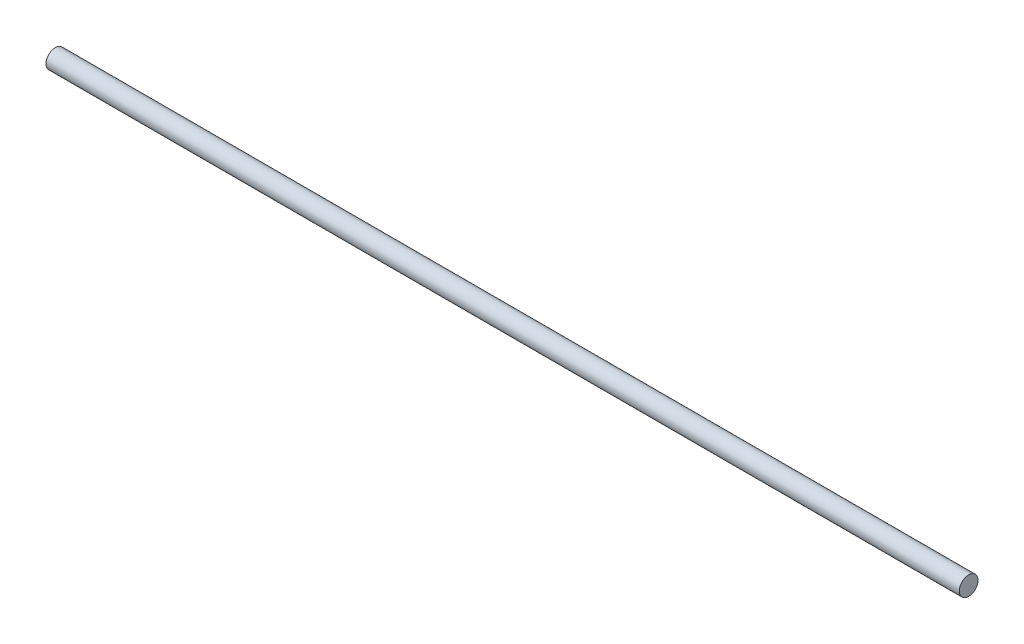
ISO-10303-21;
HEADER;
FILE_DESCRIPTION(('STEP AP214'),'2;1');
FILE_NAME('part.step','',(''),(''),'','','');
FILE_SCHEMA(('AUTOMOTIVE_DESIGN { 1 0 10303 214 1 1 1 1 }'));
ENDSEC;
DATA;
#1=APPLICATION_CONTEXT('core data for automotive mechanical design processes');
#2=APPLICATION_PROTOCOL_DEFINITION('international standard','automotive_design',2000,#1);
#3=PRODUCT_CONTEXT('',#1,'mechanical');
#4=PRODUCT('Part','Part','',(#3));
#5=PRODUCT_RELATED_PRODUCT_CATEGORY('part','',(#4));
#6=PRODUCT_DEFINITION_FORMATION('','',#4);
#7=PRODUCT_DEFINITION_CONTEXT('part definition',#1,'design');
#8=PRODUCT_DEFINITION('design','',#6,#7);
#9=PRODUCT_DEFINITION_SHAPE('','',#8);
#10=(LENGTH_UNIT() NAMED_UNIT(*) SI_UNIT(.MILLI.,.METRE.));
#11=(NAMED_UNIT(*) PLANE_ANGLE_UNIT() SI_UNIT($,.RADIAN.));
#12=(NAMED_UNIT(*) SI_UNIT($,.STERADIAN.) SOLID_ANGLE_UNIT());
#13=UNCERTAINTY_MEASURE_WITH_UNIT(LENGTH_MEASURE(1.E-05),#10,'distance_accuracy_value','');
#14=(GEOMETRIC_REPRESENTATION_CONTEXT(3) GLOBAL_UNCERTAINTY_ASSIGNED_CONTEXT((#13)) GLOBAL_UNIT_ASSIGNED_CONTEXT((#10,
#11,#12)) REPRESENTATION_CONTEXT('',''));
#15=CARTESIAN_POINT('',(0.,0.,0.));
#16=DIRECTION('',(0.,0.,1.));
#17=DIRECTION('',(1.,0.,0.));
#18=AXIS2_PLACEMENT_3D('',#15,#16,#17);
#19=CARTESIAN_POINT('',(390.,0.,0.));
#20=DIRECTION('',(-1.,0.,0.));
#21=DIRECTION('',(0.,0.,1.));
#22=AXIS2_PLACEMENT_3D('',#19,#20,#21);
#23=CYLINDRICAL_SURFACE('',#22,4.);
#24=CARTESIAN_POINT('',(390.,0.,0.));
#25=DIRECTION('',(1.,0.,0.));
#26=DIRECTION('',(0.,0.,-1.));
#27=AXIS2_PLACEMENT_3D('',#24,#25,#26);
#28=CIRCLE('',#27,4.);
#29=CARTESIAN_POINT('',(390.,0.,-4.));
#30=VERTEX_POINT('',#29);
#31=EDGE_CURVE('E10',#30,#30,#28,.T.);
#32=ORIENTED_EDGE('',*,*,#31,.F.);
#33=EDGE_LOOP('',(#32));
#34=FACE_BOUND('',#33,.T.);
#35=CARTESIAN_POINT('',(0.,0.,0.));
#36=DIRECTION('',(1.,0.,0.));
#37=DIRECTION('',(0.,0.,-1.));
#38=AXIS2_PLACEMENT_3D('',#35,#36,#37);
#39=CIRCLE('',#38,4.);
#40=CARTESIAN_POINT('',(0.,0.,-4.));
#41=VERTEX_POINT('',#40);
#42=EDGE_CURVE('E34',#41,#41,#39,.T.);
#43=ORIENTED_EDGE('',*,*,#42,.T.);
#44=EDGE_LOOP('',(#43));
#45=FACE_BOUND('',#44,.T.);
#46=ADVANCED_FACE('F31',(#34,#45),#23,.T.);
#47=CARTESIAN_POINT('',(390.,0.,0.));
#48=DIRECTION('',(1.,0.,0.));
#49=DIRECTION('',(0.,0.,-1.));
#50=AXIS2_PLACEMENT_3D('',#47,#48,#49);
#51=PLANE('',#50);
#52=ORIENTED_EDGE('',*,*,#31,.T.);
#53=EDGE_LOOP('',(#52));
#54=FACE_BOUND('',#53,.T.);
#55=ADVANCED_FACE('F46',(#54),#51,.T.);
#56=CARTESIAN_POINT('',(0.,0.,0.));
#57=DIRECTION('',(1.,0.,0.));
#58=DIRECTION('',(0.,0.,-1.));
#59=AXIS2_PLACEMENT_3D('',#56,#57,#58);
#60=PLANE('',#59);
#61=ORIENTED_EDGE('',*,*,#42,.F.);
#62=EDGE_LOOP('',(#61));
#63=FACE_BOUND('',#62,.T.);
#64=ADVANCED_FACE('F44',(#63),#60,.F.);
#65=CLOSED_SHELL('',(#46,#55,#64));
#66=MANIFOLD_SOLID_BREP('B2',#65);
#67=ADVANCED_BREP_SHAPE_REPRESENTATION('',(#18,#66),#14);
#68=SHAPE_DEFINITION_REPRESENTATION(#9,#67);
ENDSEC;
END-ISO-10303-21;
